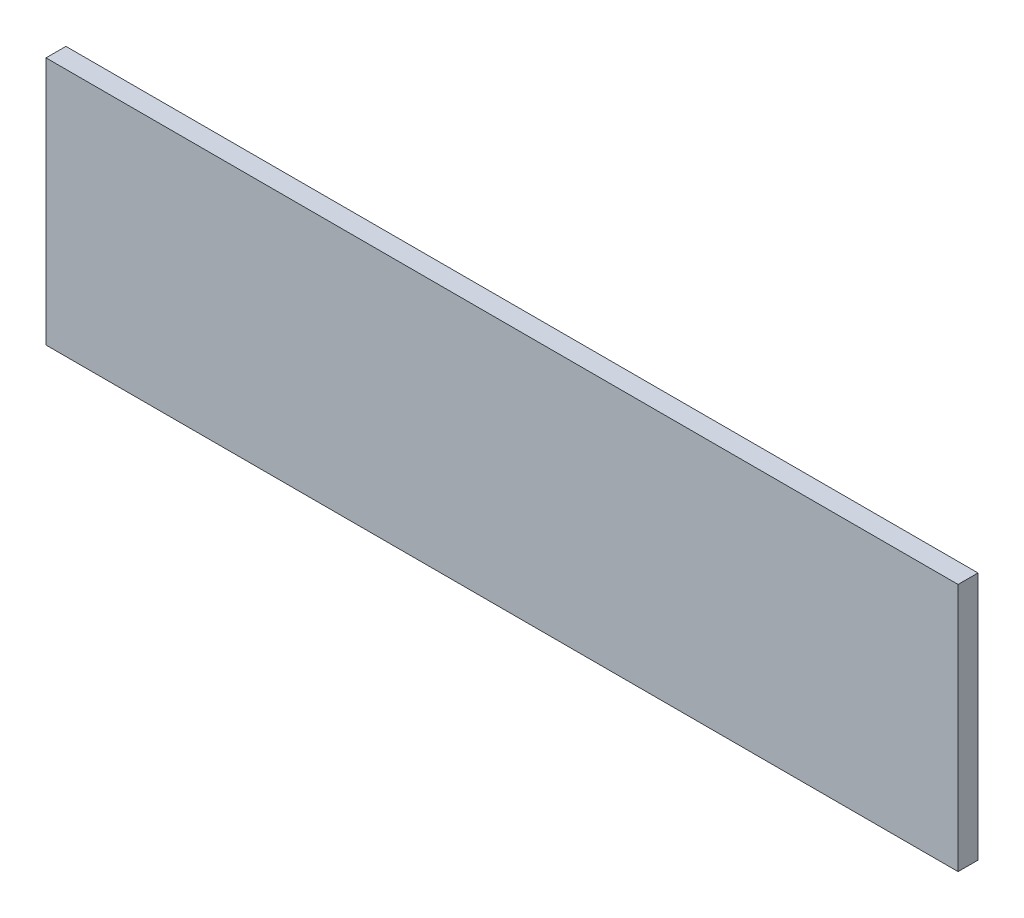
ISO-10303-21;
HEADER;
FILE_DESCRIPTION(('STEP AP214'),'2;1');
FILE_NAME('part.step','',(''),(''),'','','');
FILE_SCHEMA(('AUTOMOTIVE_DESIGN { 1 0 10303 214 1 1 1 1 }'));
ENDSEC;
DATA;
#1=APPLICATION_CONTEXT('core data for automotive mechanical design processes');
#2=APPLICATION_PROTOCOL_DEFINITION('international standard','automotive_design',2000,#1);
#3=PRODUCT_CONTEXT('',#1,'mechanical');
#4=PRODUCT('Part','Part','',(#3));
#5=PRODUCT_RELATED_PRODUCT_CATEGORY('part','',(#4));
#6=PRODUCT_DEFINITION_FORMATION('','',#4);
#7=PRODUCT_DEFINITION_CONTEXT('part definition',#1,'design');
#8=PRODUCT_DEFINITION('design','',#6,#7);
#9=PRODUCT_DEFINITION_SHAPE('','',#8);
#10=(LENGTH_UNIT() NAMED_UNIT(*) SI_UNIT(.MILLI.,.METRE.));
#11=(NAMED_UNIT(*) PLANE_ANGLE_UNIT() SI_UNIT($,.RADIAN.));
#12=(NAMED_UNIT(*) SI_UNIT($,.STERADIAN.) SOLID_ANGLE_UNIT());
#13=UNCERTAINTY_MEASURE_WITH_UNIT(LENGTH_MEASURE(1.E-05),#10,'distance_accuracy_value','');
#14=(GEOMETRIC_REPRESENTATION_CONTEXT(3) GLOBAL_UNCERTAINTY_ASSIGNED_CONTEXT((#13)) GLOBAL_UNIT_ASSIGNED_CONTEXT((#10,
#11,#12)) REPRESENTATION_CONTEXT('',''));
#15=CARTESIAN_POINT('',(0.,0.,0.));
#16=DIRECTION('',(0.,0.,1.));
#17=DIRECTION('',(1.,0.,0.));
#18=AXIS2_PLACEMENT_3D('',#15,#16,#17);
#19=CARTESIAN_POINT('',(51.,74.8959813156576,133.442125645559));
#20=DIRECTION('',(1.,0.,0.));
#21=DIRECTION('',(0.,1.,0.));
#22=AXIS2_PLACEMENT_3D('',#19,#20,#21);
#23=PLANE('',#22);
#24=DIRECTION('',(0.,-1.,0.));
#25=VECTOR('',#24,1.);
#26=CARTESIAN_POINT('',(51.,74.8959813156576,128.442125645559));
#27=LINE('',#26,#25);
#28=CARTESIAN_POINT('',(51.,74.8959813156576,128.442125645559));
#29=VERTEX_POINT('',#28);
#30=CARTESIAN_POINT('',(51.,12.4459813156576,128.442125645559));
#31=VERTEX_POINT('',#30);
#32=EDGE_CURVE('E101',#29,#31,#27,.T.);
#33=ORIENTED_EDGE('',*,*,#32,.T.);
#34=DIRECTION('',(0.,0.,-1.));
#35=VECTOR('',#34,1.);
#36=CARTESIAN_POINT('',(51.,12.4459813156576,133.442125645559));
#37=LINE('',#36,#35);
#38=CARTESIAN_POINT('',(51.,12.4459813156576,133.442125645559));
#39=VERTEX_POINT('',#38);
#40=EDGE_CURVE('E11',#39,#31,#37,.T.);
#41=ORIENTED_EDGE('',*,*,#40,.F.);
#42=DIRECTION('',(0.,-1.,0.));
#43=VECTOR('',#42,1.);
#44=CARTESIAN_POINT('',(51.,74.8959813156576,133.442125645559));
#45=LINE('',#44,#43);
#46=CARTESIAN_POINT('',(51.,74.8959813156576,133.442125645559));
#47=VERTEX_POINT('',#46);
#48=EDGE_CURVE('E89',#47,#39,#45,.T.);
#49=ORIENTED_EDGE('',*,*,#48,.F.);
#50=DIRECTION('',(0.,0.,-1.));
#51=VECTOR('',#50,1.);
#52=CARTESIAN_POINT('',(51.,74.8959813156576,133.442125645559));
#53=LINE('',#52,#51);
#54=EDGE_CURVE('E97',#47,#29,#53,.T.);
#55=ORIENTED_EDGE('',*,*,#54,.T.);
#56=EDGE_LOOP('',(#33,#41,#49,#55));
#57=FACE_BOUND('',#56,.T.);
#58=ADVANCED_FACE('F38',(#57),#23,.F.);
#59=CARTESIAN_POINT('',(51.,12.4459813156576,133.442125645559));
#60=DIRECTION('',(0.,1.,0.));
#61=DIRECTION('',(0.,0.,1.));
#62=AXIS2_PLACEMENT_3D('',#59,#60,#61);
#63=PLANE('',#62);
#64=DIRECTION('',(1.,0.,0.));
#65=VECTOR('',#64,1.);
#66=CARTESIAN_POINT('',(51.,12.4459813156576,128.442125645559));
#67=LINE('',#66,#65);
#68=CARTESIAN_POINT('',(280.,12.4459813156576,128.442125645559));
#69=VERTEX_POINT('',#68);
#70=EDGE_CURVE('E93',#31,#69,#67,.T.);
#71=ORIENTED_EDGE('',*,*,#70,.T.);
#72=DIRECTION('',(0.,0.,-1.));
#73=VECTOR('',#72,1.);
#74=CARTESIAN_POINT('',(280.,12.4459813156576,133.442125645559));
#75=LINE('',#74,#73);
#76=CARTESIAN_POINT('',(280.,12.4459813156576,133.442125645559));
#77=VERTEX_POINT('',#76);
#78=EDGE_CURVE('E46',#77,#69,#75,.T.);
#79=ORIENTED_EDGE('',*,*,#78,.F.);
#80=DIRECTION('',(1.,0.,0.));
#81=VECTOR('',#80,1.);
#82=CARTESIAN_POINT('',(51.,12.4459813156576,133.442125645559));
#83=LINE('',#82,#81);
#84=EDGE_CURVE('E84',#39,#77,#83,.T.);
#85=ORIENTED_EDGE('',*,*,#84,.F.);
#86=ORIENTED_EDGE('',*,*,#40,.T.);
#87=EDGE_LOOP('',(#71,#79,#85,#86));
#88=FACE_BOUND('',#87,.T.);
#89=ADVANCED_FACE('F92',(#88),#63,.F.);
#90=CARTESIAN_POINT('',(280.,74.8959813156576,133.442125645559));
#91=DIRECTION('',(-1.,0.,0.));
#92=DIRECTION('',(0.,0.,1.));
#93=AXIS2_PLACEMENT_3D('',#90,#91,#92);
#94=PLANE('',#93);
#95=DIRECTION('',(0.,1.,0.));
#96=VECTOR('',#95,1.);
#97=CARTESIAN_POINT('',(280.,74.8959813156576,128.442125645559));
#98=LINE('',#97,#96);
#99=CARTESIAN_POINT('',(280.,74.8959813156576,128.442125645559));
#100=VERTEX_POINT('',#99);
#101=EDGE_CURVE('E71',#69,#100,#98,.T.);
#102=ORIENTED_EDGE('',*,*,#101,.T.);
#103=DIRECTION('',(0.,0.,-1.));
#104=VECTOR('',#103,1.);
#105=CARTESIAN_POINT('',(280.,74.8959813156576,133.442125645559));
#106=LINE('',#105,#104);
#107=CARTESIAN_POINT('',(280.,74.8959813156576,133.442125645559));
#108=VERTEX_POINT('',#107);
#109=EDGE_CURVE('E94',#108,#100,#106,.T.);
#110=ORIENTED_EDGE('',*,*,#109,.F.);
#111=DIRECTION('',(0.,1.,0.));
#112=VECTOR('',#111,1.);
#113=CARTESIAN_POINT('',(280.,74.8959813156576,133.442125645559));
#114=LINE('',#113,#112);
#115=EDGE_CURVE('E87',#77,#108,#114,.T.);
#116=ORIENTED_EDGE('',*,*,#115,.F.);
#117=ORIENTED_EDGE('',*,*,#78,.T.);
#118=EDGE_LOOP('',(#102,#110,#116,#117));
#119=FACE_BOUND('',#118,.T.);
#120=ADVANCED_FACE('F95',(#119),#94,.F.);
#121=CARTESIAN_POINT('',(51.,74.8959813156576,133.442125645559));
#122=DIRECTION('',(0.,-1.,0.));
#123=DIRECTION('',(0.,0.,-1.));
#124=AXIS2_PLACEMENT_3D('',#121,#122,#123);
#125=PLANE('',#124);
#126=DIRECTION('',(-1.,0.,0.));
#127=VECTOR('',#126,1.);
#128=CARTESIAN_POINT('',(51.,74.8959813156576,128.442125645559));
#129=LINE('',#128,#127);
#130=EDGE_CURVE('E77',#100,#29,#129,.T.);
#131=ORIENTED_EDGE('',*,*,#130,.T.);
#132=ORIENTED_EDGE('',*,*,#54,.F.);
#133=DIRECTION('',(-1.,0.,0.));
#134=VECTOR('',#133,1.);
#135=CARTESIAN_POINT('',(51.,74.8959813156576,133.442125645559));
#136=LINE('',#135,#134);
#137=EDGE_CURVE('E54',#108,#47,#136,.T.);
#138=ORIENTED_EDGE('',*,*,#137,.F.);
#139=ORIENTED_EDGE('',*,*,#109,.T.);
#140=EDGE_LOOP('',(#131,#132,#138,#139));
#141=FACE_BOUND('',#140,.T.);
#142=ADVANCED_FACE('F108',(#141),#125,.F.);
#143=CARTESIAN_POINT('',(0.,0.,133.442125645559));
#144=DIRECTION('',(0.,0.,1.));
#145=DIRECTION('',(1.,0.,0.));
#146=AXIS2_PLACEMENT_3D('',#143,#144,#145);
#147=PLANE('',#146);
#148=ORIENTED_EDGE('',*,*,#48,.T.);
#149=ORIENTED_EDGE('',*,*,#84,.T.);
#150=ORIENTED_EDGE('',*,*,#115,.T.);
#151=ORIENTED_EDGE('',*,*,#137,.T.);
#152=EDGE_LOOP('',(#148,#149,#150,#151));
#153=FACE_BOUND('',#152,.T.);
#154=ADVANCED_FACE('F85',(#153),#147,.T.);
#155=CARTESIAN_POINT('',(0.,0.,128.442125645559));
#156=DIRECTION('',(0.,0.,1.));
#157=DIRECTION('',(1.,0.,0.));
#158=AXIS2_PLACEMENT_3D('',#155,#156,#157);
#159=PLANE('',#158);
#160=ORIENTED_EDGE('',*,*,#32,.F.);
#161=ORIENTED_EDGE('',*,*,#130,.F.);
#162=ORIENTED_EDGE('',*,*,#101,.F.);
#163=ORIENTED_EDGE('',*,*,#70,.F.);
#164=EDGE_LOOP('',(#160,#161,#162,#163));
#165=FACE_BOUND('',#164,.T.);
#166=ADVANCED_FACE('F111',(#165),#159,.F.);
#167=CLOSED_SHELL('',(#58,#89,#120,#142,#154,#166));
#168=MANIFOLD_SOLID_BREP('B2',#167);
#169=ADVANCED_BREP_SHAPE_REPRESENTATION('',(#18,#168),#14);
#170=SHAPE_DEFINITION_REPRESENTATION(#9,#169);
ENDSEC;
END-ISO-10303-21;
